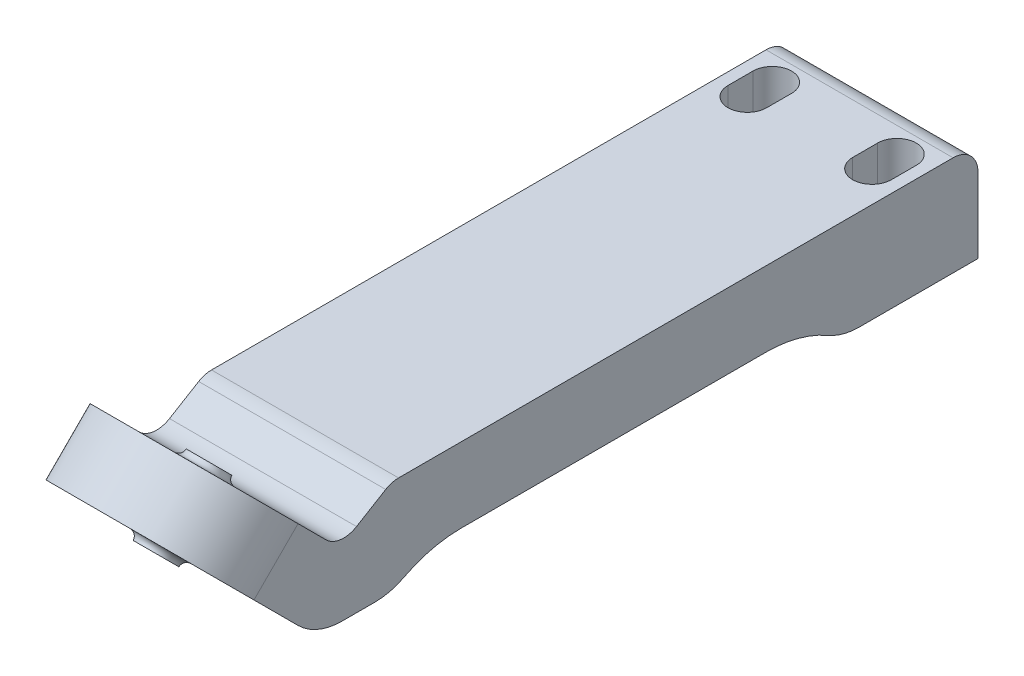
ISO-10303-21;
HEADER;
FILE_DESCRIPTION(('STEP AP214'),'2;1');
FILE_NAME('part.step','',(''),(''),'','','');
FILE_SCHEMA(('AUTOMOTIVE_DESIGN { 1 0 10303 214 1 1 1 1 }'));
ENDSEC;
DATA;
#1=APPLICATION_CONTEXT('core data for automotive mechanical design processes');
#2=APPLICATION_PROTOCOL_DEFINITION('international standard','automotive_design',2000,#1);
#3=PRODUCT_CONTEXT('',#1,'mechanical');
#4=PRODUCT('Part','Part','',(#3));
#5=PRODUCT_RELATED_PRODUCT_CATEGORY('part','',(#4));
#6=PRODUCT_DEFINITION_FORMATION('','',#4);
#7=PRODUCT_DEFINITION_CONTEXT('part definition',#1,'design');
#8=PRODUCT_DEFINITION('design','',#6,#7);
#9=PRODUCT_DEFINITION_SHAPE('','',#8);
#10=(LENGTH_UNIT() NAMED_UNIT(*) SI_UNIT(.MILLI.,.METRE.));
#11=(NAMED_UNIT(*) PLANE_ANGLE_UNIT() SI_UNIT($,.RADIAN.));
#12=(NAMED_UNIT(*) SI_UNIT($,.STERADIAN.) SOLID_ANGLE_UNIT());
#13=UNCERTAINTY_MEASURE_WITH_UNIT(LENGTH_MEASURE(1.E-05),#10,'distance_accuracy_value','');
#14=(GEOMETRIC_REPRESENTATION_CONTEXT(3) GLOBAL_UNCERTAINTY_ASSIGNED_CONTEXT((#13)) GLOBAL_UNIT_ASSIGNED_CONTEXT((#10,
#11,#12)) REPRESENTATION_CONTEXT('',''));
#15=CARTESIAN_POINT('',(0.,0.,0.));
#16=DIRECTION('',(0.,0.,1.));
#17=DIRECTION('',(1.,0.,0.));
#18=AXIS2_PLACEMENT_3D('',#15,#16,#17);
#19=CARTESIAN_POINT('',(-7.5,20.6821178799464,41.));
#20=DIRECTION('',(0.,1.,0.));
#21=DIRECTION('',(0.,0.,1.));
#22=AXIS2_PLACEMENT_3D('',#19,#20,#21);
#23=PLANE('',#22);
#24=DIRECTION('',(0.,0.,-1.));
#25=VECTOR('',#24,1.);
#26=CARTESIAN_POINT('',(6.55000000000001,20.6821178799464,41.));
#27=LINE('',#26,#25);
#28=CARTESIAN_POINT('',(6.55,20.6821178799464,6.00000000000001));
#29=VERTEX_POINT('',#28);
#30=CARTESIAN_POINT('',(6.55000000000001,20.6821178799464,4.));
#31=VERTEX_POINT('',#30);
#32=EDGE_CURVE('E314',#29,#31,#27,.T.);
#33=ORIENTED_EDGE('',*,*,#32,.T.);
#34=CARTESIAN_POINT('',(4.99999999999999,20.6821178799464,4.));
#35=DIRECTION('',(0.,1.,0.));
#36=DIRECTION('',(0.,0.,1.));
#37=AXIS2_PLACEMENT_3D('',#34,#35,#36);
#38=CIRCLE('',#37,1.55);
#39=CARTESIAN_POINT('',(3.45000000000001,20.6821178799464,4.));
#40=VERTEX_POINT('',#39);
#41=EDGE_CURVE('E317',#31,#40,#38,.T.);
#42=ORIENTED_EDGE('',*,*,#41,.T.);
#43=DIRECTION('',(0.,0.,1.));
#44=VECTOR('',#43,1.);
#45=CARTESIAN_POINT('',(3.45,20.6821178799464,41.));
#46=LINE('',#45,#44);
#47=CARTESIAN_POINT('',(3.45000000000001,20.6821178799464,6.00000000000001));
#48=VERTEX_POINT('',#47);
#49=EDGE_CURVE('E308',#40,#48,#46,.T.);
#50=ORIENTED_EDGE('',*,*,#49,.T.);
#51=CARTESIAN_POINT('',(4.99999999999999,20.6821178799464,6.));
#52=DIRECTION('',(0.,1.,0.));
#53=DIRECTION('',(0.,0.,1.));
#54=AXIS2_PLACEMENT_3D('',#51,#52,#53);
#55=CIRCLE('',#54,1.55);
#56=EDGE_CURVE('E311',#48,#29,#55,.T.);
#57=ORIENTED_EDGE('',*,*,#56,.T.);
#58=EDGE_LOOP('',(#33,#42,#50,#57));
#59=FACE_BOUND('',#58,.T.);
#60=DIRECTION('',(0.,0.,-1.));
#61=VECTOR('',#60,1.);
#62=CARTESIAN_POINT('',(-3.45000000000001,20.6821178799464,41.));
#63=LINE('',#62,#61);
#64=CARTESIAN_POINT('',(-3.45000000000001,20.6821178799464,6.));
#65=VERTEX_POINT('',#64);
#66=CARTESIAN_POINT('',(-3.45000000000001,20.6821178799464,4.));
#67=VERTEX_POINT('',#66);
#68=EDGE_CURVE('E326',#65,#67,#63,.T.);
#69=ORIENTED_EDGE('',*,*,#68,.T.);
#70=CARTESIAN_POINT('',(-5.00000000000001,20.6821178799464,4.));
#71=DIRECTION('',(0.,1.,0.));
#72=DIRECTION('',(0.,0.,1.));
#73=AXIS2_PLACEMENT_3D('',#70,#71,#72);
#74=CIRCLE('',#73,1.55);
#75=CARTESIAN_POINT('',(-6.55000000000001,20.6821178799464,3.99999999999999));
#76=VERTEX_POINT('',#75);
#77=EDGE_CURVE('E329',#67,#76,#74,.T.);
#78=ORIENTED_EDGE('',*,*,#77,.T.);
#79=DIRECTION('',(0.,0.,1.));
#80=VECTOR('',#79,1.);
#81=CARTESIAN_POINT('',(-6.55000000000001,20.6821178799464,41.));
#82=LINE('',#81,#80);
#83=CARTESIAN_POINT('',(-6.55000000000001,20.6821178799464,6.00000000000001));
#84=VERTEX_POINT('',#83);
#85=EDGE_CURVE('E320',#76,#84,#82,.T.);
#86=ORIENTED_EDGE('',*,*,#85,.T.);
#87=CARTESIAN_POINT('',(-5.00000000000001,20.6821178799464,6.));
#88=DIRECTION('',(0.,1.,0.));
#89=DIRECTION('',(0.,0.,1.));
#90=AXIS2_PLACEMENT_3D('',#87,#88,#89);
#91=CIRCLE('',#90,1.55);
#92=EDGE_CURVE('E323',#84,#65,#91,.T.);
#93=ORIENTED_EDGE('',*,*,#92,.T.);
#94=EDGE_LOOP('',(#69,#78,#86,#93));
#95=FACE_BOUND('',#94,.T.);
#96=DIRECTION('',(0.,0.,-1.));
#97=VECTOR('',#96,1.);
#98=CARTESIAN_POINT('',(7.5,20.6821178799464,41.));
#99=LINE('',#98,#97);
#100=CARTESIAN_POINT('',(7.5,20.6821178799464,9.51668522645213));
#101=VERTEX_POINT('',#100);
#102=CARTESIAN_POINT('',(7.5,20.6821178799464,0.));
#103=VERTEX_POINT('',#102);
#104=EDGE_CURVE('E301',#101,#103,#99,.T.);
#105=ORIENTED_EDGE('',*,*,#104,.F.);
#106=DIRECTION('',(-1.,0.,0.));
#107=VECTOR('',#106,1.);
#108=CARTESIAN_POINT('',(-7.5,20.6821178799464,9.51668522645213));
#109=LINE('',#108,#107);
#110=CARTESIAN_POINT('',(-7.5,20.6821178799464,9.51668522645213));
#111=VERTEX_POINT('',#110);
#112=EDGE_CURVE('E383',#101,#111,#109,.T.);
#113=ORIENTED_EDGE('',*,*,#112,.T.);
#114=DIRECTION('',(0.,0.,-1.));
#115=VECTOR('',#114,1.);
#116=CARTESIAN_POINT('',(-7.5,20.6821178799464,41.));
#117=LINE('',#116,#115);
#118=CARTESIAN_POINT('',(-7.5,20.6821178799464,0.));
#119=VERTEX_POINT('',#118);
#120=EDGE_CURVE('E303',#111,#119,#117,.T.);
#121=ORIENTED_EDGE('',*,*,#120,.T.);
#122=DIRECTION('',(1.,0.,0.));
#123=VECTOR('',#122,1.);
#124=CARTESIAN_POINT('',(-7.5,20.6821178799464,0.));
#125=LINE('',#124,#123);
#126=EDGE_CURVE('E293',#119,#103,#125,.T.);
#127=ORIENTED_EDGE('',*,*,#126,.T.);
#128=EDGE_LOOP('',(#105,#113,#121,#127));
#129=FACE_BOUND('',#128,.T.);
#130=ADVANCED_FACE('F43',(#59,#95,#129),#23,.F.);
#131=CARTESIAN_POINT('',(7.50000000000001,26.,51.));
#132=DIRECTION('',(0.,0.707106781186551,-0.707106781186544));
#133=DIRECTION('',(0.,0.707106781186544,0.707106781186551));
#134=AXIS2_PLACEMENT_3D('',#131,#132,#133);
#135=PLANE('',#134);
#136=CARTESIAN_POINT('',(0.,29.5355339059327,54.5355339059328));
#137=DIRECTION('',(0.,0.707106781186551,-0.707106781186544));
#138=DIRECTION('',(0.,0.707106781186544,0.707106781186551));
#139=AXIS2_PLACEMENT_3D('',#136,#137,#138);
#140=CIRCLE('',#139,2.);
#141=CARTESIAN_POINT('',(0.,30.9497474683058,55.9497474683059));
#142=VERTEX_POINT('',#141);
#143=EDGE_CURVE('E335',#142,#142,#140,.F.);
#144=ORIENTED_EDGE('',*,*,#143,.T.);
#145=EDGE_LOOP('',(#144));
#146=FACE_BOUND('',#145,.T.);
#147=DIRECTION('',(0.,-0.707106781186544,-0.707106781186551));
#148=VECTOR('',#147,1.);
#149=CARTESIAN_POINT('',(7.50000000000001,26.,51.));
#150=LINE('',#149,#148);
#151=CARTESIAN_POINT('',(7.50000000000001,29.5355339059327,54.5355339059327));
#152=VERTEX_POINT('',#151);
#153=CARTESIAN_POINT('',(7.50000000000001,27.2901535386176,52.2901535386177));
#154=VERTEX_POINT('',#153);
#155=EDGE_CURVE('E242',#152,#154,#150,.T.);
#156=ORIENTED_EDGE('',*,*,#155,.T.);
#157=DIRECTION('',(-1.,0.,0.));
#158=VECTOR('',#157,1.);
#159=CARTESIAN_POINT('',(7.50000000000001,27.2901535386176,52.2901535386177));
#160=LINE('',#159,#158);
#161=CARTESIAN_POINT('',(-7.5,27.2901535386176,52.2901535386177));
#162=VERTEX_POINT('',#161);
#163=EDGE_CURVE('E232',#154,#162,#160,.T.);
#164=ORIENTED_EDGE('',*,*,#163,.T.);
#165=DIRECTION('',(0.,-0.707106781186544,-0.707106781186551));
#166=VECTOR('',#165,1.);
#167=CARTESIAN_POINT('',(-7.5,26.,51.));
#168=LINE('',#167,#166);
#169=CARTESIAN_POINT('',(-7.5,29.5355339059327,54.5355339059327));
#170=VERTEX_POINT('',#169);
#171=EDGE_CURVE('E225',#170,#162,#168,.T.);
#172=ORIENTED_EDGE('',*,*,#171,.F.);
#173=CARTESIAN_POINT('',(0.,29.5355339059327,54.5355339059327));
#174=DIRECTION('',(0.,-0.707106781186551,0.707106781186544));
#175=DIRECTION('',(0.,0.707106781186544,0.707106781186551));
#176=AXIS2_PLACEMENT_3D('',#173,#174,#175);
#177=CIRCLE('',#176,7.5);
#178=EDGE_CURVE('E209',#152,#170,#177,.T.);
#179=ORIENTED_EDGE('',*,*,#178,.F.);
#180=EDGE_LOOP('',(#156,#164,#172,#179));
#181=FACE_BOUND('',#180,.T.);
#182=ADVANCED_FACE('F230',(#146,#181),#135,.T.);
#183=CARTESIAN_POINT('',(7.50000000000001,26.,58.0710678118655));
#184=DIRECTION('',(0.,-0.707106781186551,0.707106781186544));
#185=DIRECTION('',(0.,-0.707106781186544,-0.707106781186551));
#186=AXIS2_PLACEMENT_3D('',#183,#184,#185);
#187=PLANE('',#186);
#188=CARTESIAN_POINT('',(0.,26.,58.0710678118655));
#189=DIRECTION('',(0.,-0.707106781186551,0.707106781186544));
#190=DIRECTION('',(0.,-0.707106781186544,-0.707106781186551));
#191=AXIS2_PLACEMENT_3D('',#188,#189,#190);
#192=CIRCLE('',#191,2.);
#193=CARTESIAN_POINT('',(0.,24.5857864376269,56.6568542494924));
#194=VERTEX_POINT('',#193);
#195=EDGE_CURVE('E332',#194,#194,#192,.F.);
#196=ORIENTED_EDGE('',*,*,#195,.T.);
#197=EDGE_LOOP('',(#196));
#198=FACE_BOUND('',#197,.T.);
#199=DIRECTION('',(0.,0.707106781186544,0.707106781186551));
#200=VECTOR('',#199,1.);
#201=CARTESIAN_POINT('',(-7.5,26.,58.0710678118655));
#202=LINE('',#201,#200);
#203=CARTESIAN_POINT('',(-7.5,22.4644660940672,54.5355339059327));
#204=VERTEX_POINT('',#203);
#205=CARTESIAN_POINT('',(-7.5,26.,58.0710678118655));
#206=VERTEX_POINT('',#205);
#207=EDGE_CURVE('E220',#204,#206,#202,.T.);
#208=ORIENTED_EDGE('',*,*,#207,.F.);
#209=DIRECTION('',(-1.,0.,0.));
#210=VECTOR('',#209,1.);
#211=CARTESIAN_POINT('',(7.50000000000001,22.4644660940672,54.5355339059327));
#212=LINE('',#211,#210);
#213=CARTESIAN_POINT('',(7.50000000000001,22.4644660940672,54.5355339059327));
#214=VERTEX_POINT('',#213);
#215=EDGE_CURVE('E399',#204,#214,#212,.F.);
#216=ORIENTED_EDGE('',*,*,#215,.T.);
#217=DIRECTION('',(0.,0.707106781186544,0.707106781186551));
#218=VECTOR('',#217,1.);
#219=CARTESIAN_POINT('',(7.50000000000001,26.,58.0710678118655));
#220=LINE('',#219,#218);
#221=CARTESIAN_POINT('',(7.50000000000001,26.,58.0710678118655));
#222=VERTEX_POINT('',#221);
#223=EDGE_CURVE('E233',#214,#222,#220,.T.);
#224=ORIENTED_EDGE('',*,*,#223,.T.);
#225=CARTESIAN_POINT('',(0.,26.,58.0710678118655));
#226=DIRECTION('',(0.,-0.707106781186551,0.707106781186544));
#227=DIRECTION('',(0.,0.707106781186544,0.707106781186551));
#228=AXIS2_PLACEMENT_3D('',#225,#226,#227);
#229=CIRCLE('',#228,7.5);
#230=EDGE_CURVE('E221',#222,#206,#229,.T.);
#231=ORIENTED_EDGE('',*,*,#230,.T.);
#232=EDGE_LOOP('',(#208,#216,#224,#231));
#233=FACE_BOUND('',#232,.T.);
#234=ADVANCED_FACE('F436',(#198,#233),#187,.T.);
#235=CARTESIAN_POINT('',(7.5,28.6821178799464,41.));
#236=DIRECTION('',(0.,-1.,0.));
#237=DIRECTION('',(0.,0.,-1.));
#238=AXIS2_PLACEMENT_3D('',#235,#236,#237);
#239=PLANE('',#238);
#240=DIRECTION('',(0.,0.,1.));
#241=VECTOR('',#240,1.);
#242=CARTESIAN_POINT('',(-6.55000000000001,28.6821178799464,3.99999999999999));
#243=LINE('',#242,#241);
#244=CARTESIAN_POINT('',(-6.55000000000001,28.6821178799464,4.));
#245=VERTEX_POINT('',#244);
#246=CARTESIAN_POINT('',(-6.55000000000001,28.6821178799464,6.));
#247=VERTEX_POINT('',#246);
#248=EDGE_CURVE('E254',#245,#247,#243,.T.);
#249=ORIENTED_EDGE('',*,*,#248,.F.);
#250=CARTESIAN_POINT('',(-5.00000000000001,28.6821178799464,4.));
#251=DIRECTION('',(0.,1.,0.));
#252=DIRECTION('',(0.,0.,1.));
#253=AXIS2_PLACEMENT_3D('',#250,#251,#252);
#254=CIRCLE('',#253,1.55);
#255=CARTESIAN_POINT('',(-3.45000000000001,28.6821178799464,4.));
#256=VERTEX_POINT('',#255);
#257=EDGE_CURVE('E252',#256,#245,#254,.T.);
#258=ORIENTED_EDGE('',*,*,#257,.F.);
#259=DIRECTION('',(0.,0.,-1.));
#260=VECTOR('',#259,1.);
#261=CARTESIAN_POINT('',(-3.45000000000001,28.6821178799464,4.));
#262=LINE('',#261,#260);
#263=CARTESIAN_POINT('',(-3.45000000000001,28.6821178799464,6.));
#264=VERTEX_POINT('',#263);
#265=EDGE_CURVE('E261',#264,#256,#262,.T.);
#266=ORIENTED_EDGE('',*,*,#265,.F.);
#267=CARTESIAN_POINT('',(-5.00000000000001,28.6821178799464,6.));
#268=DIRECTION('',(0.,1.,0.));
#269=DIRECTION('',(0.,0.,1.));
#270=AXIS2_PLACEMENT_3D('',#267,#268,#269);
#271=CIRCLE('',#270,1.55);
#272=EDGE_CURVE('E258',#247,#264,#271,.T.);
#273=ORIENTED_EDGE('',*,*,#272,.F.);
#274=EDGE_LOOP('',(#249,#258,#266,#273));
#275=FACE_BOUND('',#274,.T.);
#276=DIRECTION('',(0.,0.,1.));
#277=VECTOR('',#276,1.);
#278=CARTESIAN_POINT('',(3.45000000000001,28.6821178799464,4.));
#279=LINE('',#278,#277);
#280=CARTESIAN_POINT('',(3.45000000000001,28.6821178799464,4.));
#281=VERTEX_POINT('',#280);
#282=CARTESIAN_POINT('',(3.45000000000001,28.6821178799464,6.00000000000001));
#283=VERTEX_POINT('',#282);
#284=EDGE_CURVE('E288',#281,#283,#279,.T.);
#285=ORIENTED_EDGE('',*,*,#284,.F.);
#286=CARTESIAN_POINT('',(4.99999999999999,28.6821178799464,4.));
#287=DIRECTION('',(0.,1.,0.));
#288=DIRECTION('',(0.,0.,-1.));
#289=AXIS2_PLACEMENT_3D('',#286,#287,#288);
#290=CIRCLE('',#289,1.55);
#291=CARTESIAN_POINT('',(6.55000000000001,28.6821178799464,4.));
#292=VERTEX_POINT('',#291);
#293=EDGE_CURVE('E255',#292,#281,#290,.T.);
#294=ORIENTED_EDGE('',*,*,#293,.F.);
#295=DIRECTION('',(0.,0.,-1.));
#296=VECTOR('',#295,1.);
#297=CARTESIAN_POINT('',(6.55000000000001,28.6821178799464,4.));
#298=LINE('',#297,#296);
#299=CARTESIAN_POINT('',(6.55,28.6821178799464,6.00000000000001));
#300=VERTEX_POINT('',#299);
#301=EDGE_CURVE('E277',#300,#292,#298,.T.);
#302=ORIENTED_EDGE('',*,*,#301,.F.);
#303=CARTESIAN_POINT('',(4.99999999999999,28.6821178799464,6.));
#304=DIRECTION('',(0.,1.,0.));
#305=DIRECTION('',(0.,0.,-1.));
#306=AXIS2_PLACEMENT_3D('',#303,#304,#305);
#307=CIRCLE('',#306,1.55);
#308=EDGE_CURVE('E285',#283,#300,#307,.T.);
#309=ORIENTED_EDGE('',*,*,#308,.F.);
#310=EDGE_LOOP('',(#285,#294,#302,#309));
#311=FACE_BOUND('',#310,.T.);
#312=DIRECTION('',(0.,0.,-1.));
#313=VECTOR('',#312,1.);
#314=CARTESIAN_POINT('',(7.5,28.6821178799464,41.));
#315=LINE('',#314,#313);
#316=CARTESIAN_POINT('',(7.5,28.6821178799464,46.4751117573865));
#317=VERTEX_POINT('',#316);
#318=CARTESIAN_POINT('',(7.5,28.6821178799464,2.));
#319=VERTEX_POINT('',#318);
#320=EDGE_CURVE('E298',#317,#319,#315,.T.);
#321=ORIENTED_EDGE('',*,*,#320,.T.);
#322=DIRECTION('',(-1.,0.,0.));
#323=VECTOR('',#322,1.);
#324=CARTESIAN_POINT('',(7.5,28.6821178799464,2.));
#325=LINE('',#324,#323);
#326=CARTESIAN_POINT('',(-7.5,28.6821178799464,2.));
#327=VERTEX_POINT('',#326);
#328=EDGE_CURVE('E401',#319,#327,#325,.T.);
#329=ORIENTED_EDGE('',*,*,#328,.T.);
#330=DIRECTION('',(0.,0.,-1.));
#331=VECTOR('',#330,1.);
#332=CARTESIAN_POINT('',(-7.5,28.6821178799464,41.));
#333=LINE('',#332,#331);
#334=CARTESIAN_POINT('',(-7.5,28.6821178799464,46.4751117573865));
#335=VERTEX_POINT('',#334);
#336=EDGE_CURVE('E306',#335,#327,#333,.T.);
#337=ORIENTED_EDGE('',*,*,#336,.F.);
#338=DIRECTION('',(1.,0.,0.));
#339=VECTOR('',#338,1.);
#340=CARTESIAN_POINT('',(7.5,28.6821178799464,46.4751117573865));
#341=LINE('',#340,#339);
#342=EDGE_CURVE('E344',#335,#317,#341,.T.);
#343=ORIENTED_EDGE('',*,*,#342,.T.);
#344=EDGE_LOOP('',(#321,#329,#337,#343));
#345=FACE_BOUND('',#344,.T.);
#346=ADVANCED_FACE('F407',(#275,#311,#345),#239,.F.);
#347=CARTESIAN_POINT('',(-7.5,28.6821178799464,41.));
#348=DIRECTION('',(1.,0.,0.));
#349=DIRECTION('',(0.,0.,-1.));
#350=AXIS2_PLACEMENT_3D('',#347,#348,#349);
#351=PLANE('',#350);
#352=ORIENTED_EDGE('',*,*,#336,.T.);
#353=CARTESIAN_POINT('',(-7.5,26.6821178799464,2.));
#354=DIRECTION('',(1.,0.,0.));
#355=DIRECTION('',(0.,0.,-1.));
#356=AXIS2_PLACEMENT_3D('',#353,#354,#355);
#357=CIRCLE('',#356,2.);
#358=CARTESIAN_POINT('',(-7.5,26.6821178799464,0.));
#359=VERTEX_POINT('',#358);
#360=EDGE_CURVE('E65',#327,#359,#357,.F.);
#361=ORIENTED_EDGE('',*,*,#360,.T.);
#362=DIRECTION('',(0.,-1.,0.));
#363=VECTOR('',#362,1.);
#364=CARTESIAN_POINT('',(-7.5,28.6821178799464,0.));
#365=LINE('',#364,#363);
#366=EDGE_CURVE('E267',#359,#119,#365,.T.);
#367=ORIENTED_EDGE('',*,*,#366,.T.);
#368=ORIENTED_EDGE('',*,*,#120,.F.);
#369=CARTESIAN_POINT('',(-7.5,25.6821178799464,9.51668522645213));
#370=DIRECTION('',(1.,0.,0.));
#371=DIRECTION('',(0.,0.,-1.));
#372=AXIS2_PLACEMENT_3D('',#369,#370,#371);
#373=CIRCLE('',#372,5.);
#374=CARTESIAN_POINT('',(-7.5,21.3487845466131,12.0111234843014));
#375=VERTEX_POINT('',#374);
#376=EDGE_CURVE('E389',#111,#375,#373,.F.);
#377=ORIENTED_EDGE('',*,*,#376,.T.);
#378=CARTESIAN_POINT('',(-7.5,12.6821178799464,17.));
#379=DIRECTION('',(1.,0.,0.));
#380=DIRECTION('',(0.,0.,-1.));
#381=AXIS2_PLACEMENT_3D('',#378,#379,#380);
#382=CIRCLE('',#381,10.);
#383=CARTESIAN_POINT('',(-7.5,22.6821178799464,17.));
#384=VERTEX_POINT('',#383);
#385=EDGE_CURVE('E364',#375,#384,#382,.T.);
#386=ORIENTED_EDGE('',*,*,#385,.T.);
#387=DIRECTION('',(0.,0.,-1.));
#388=VECTOR('',#387,1.);
#389=CARTESIAN_POINT('',(-7.5,22.6821178799464,47.));
#390=LINE('',#389,#388);
#391=CARTESIAN_POINT('',(-7.5,22.6821178799464,41.4490688135329));
#392=VERTEX_POINT('',#391);
#393=EDGE_CURVE('E248',#392,#384,#390,.T.);
#394=ORIENTED_EDGE('',*,*,#393,.F.);
#395=CARTESIAN_POINT('',(-7.5,12.6821178799464,41.4490688135329));
#396=DIRECTION('',(1.,0.,0.));
#397=DIRECTION('',(0.,0.,-1.));
#398=AXIS2_PLACEMENT_3D('',#395,#396,#397);
#399=CIRCLE('',#398,10.);
#400=CARTESIAN_POINT('',(-7.5,21.5607059599821,46.0502288525934));
#401=VERTEX_POINT('',#400);
#402=EDGE_CURVE('E371',#392,#401,#399,.T.);
#403=ORIENTED_EDGE('',*,*,#402,.T.);
#404=CARTESIAN_POINT('',(-7.5,26.,48.3508088721237));
#405=DIRECTION('',(1.,0.,0.));
#406=DIRECTION('',(0.,0.,-1.));
#407=AXIS2_PLACEMENT_3D('',#404,#405,#406);
#408=CIRCLE('',#407,5.);
#409=CARTESIAN_POINT('',(-7.5,21.,48.3508088721237));
#410=VERTEX_POINT('',#409);
#411=EDGE_CURVE('E387',#401,#410,#408,.F.);
#412=ORIENTED_EDGE('',*,*,#411,.T.);
#413=DIRECTION('',(0.,0.,-1.));
#414=VECTOR('',#413,1.);
#415=CARTESIAN_POINT('',(-7.5,21.,51.));
#416=LINE('',#415,#414);
#417=CARTESIAN_POINT('',(-7.5,21.,51.));
#418=VERTEX_POINT('',#417);
#419=EDGE_CURVE('E241',#418,#410,#416,.T.);
#420=ORIENTED_EDGE('',*,*,#419,.F.);
#421=CARTESIAN_POINT('',(-7.5,26.,51.));
#422=DIRECTION('',(1.,0.,0.));
#423=DIRECTION('',(0.,0.,-1.));
#424=AXIS2_PLACEMENT_3D('',#421,#422,#423);
#425=CIRCLE('',#424,5.);
#426=EDGE_CURVE('E385',#418,#204,#425,.F.);
#427=ORIENTED_EDGE('',*,*,#426,.T.);
#428=ORIENTED_EDGE('',*,*,#207,.T.);
#429=DIRECTION('',(0.,0.707106781186551,-0.707106781186544));
#430=VECTOR('',#429,1.);
#431=CARTESIAN_POINT('',(-7.5,29.5355339059327,54.5355339059328));
#432=LINE('',#431,#430);
#433=EDGE_CURVE('E213',#206,#170,#432,.T.);
#434=ORIENTED_EDGE('',*,*,#433,.T.);
#435=ORIENTED_EDGE('',*,*,#171,.T.);
#436=CARTESIAN_POINT('',(-7.5,28.7043671009907,50.8759399762446));
#437=DIRECTION('',(1.,0.,0.));
#438=DIRECTION('',(0.,0.,-1.));
#439=AXIS2_PLACEMENT_3D('',#436,#437,#438);
#440=CIRCLE('',#439,2.);
#441=CARTESIAN_POINT('',(-7.5,26.9900324995865,49.8458638264245));
#442=VERTEX_POINT('',#441);
#443=EDGE_CURVE('E356',#162,#442,#440,.T.);
#444=ORIENTED_EDGE('',*,*,#443,.T.);
#445=DIRECTION('',(0.,0.515038074910051,-0.857167300702114));
#446=VECTOR('',#445,1.);
#447=CARTESIAN_POINT('',(-7.5,31.3440992919737,42.5994797990706));
#448=LINE('',#447,#446);
#449=CARTESIAN_POINT('',(-7.5,28.3964524813507,47.5051879072066));
#450=VERTEX_POINT('',#449);
#451=EDGE_CURVE('E338',#442,#450,#448,.T.);
#452=ORIENTED_EDGE('',*,*,#451,.T.);
#453=CARTESIAN_POINT('',(-7.5,26.6821178799464,46.4751117573865));
#454=DIRECTION('',(1.,0.,0.));
#455=DIRECTION('',(0.,0.,-1.));
#456=AXIS2_PLACEMENT_3D('',#453,#454,#455);
#457=CIRCLE('',#456,2.);
#458=EDGE_CURVE('E353',#450,#335,#457,.F.);
#459=ORIENTED_EDGE('',*,*,#458,.T.);
#460=EDGE_LOOP('',(#352,#361,#367,#368,#377,#386,#394,#403,#412,#420,#427,#428,#434,#435,#444,
#452,#459));
#461=FACE_BOUND('',#460,.T.);
#462=ADVANCED_FACE('F224',(#461),#351,.F.);
#463=CARTESIAN_POINT('',(7.5,20.6821178799464,41.));
#464=DIRECTION('',(-1.,0.,0.));
#465=DIRECTION('',(0.,0.,1.));
#466=AXIS2_PLACEMENT_3D('',#463,#464,#465);
#467=PLANE('',#466);
#468=DIRECTION('',(0.,1.,0.));
#469=VECTOR('',#468,1.);
#470=CARTESIAN_POINT('',(7.5,20.6821178799464,0.));
#471=LINE('',#470,#469);
#472=CARTESIAN_POINT('',(7.5,26.6821178799464,0.));
#473=VERTEX_POINT('',#472);
#474=EDGE_CURVE('E296',#103,#473,#471,.T.);
#475=ORIENTED_EDGE('',*,*,#474,.T.);
#476=CARTESIAN_POINT('',(7.5,26.6821178799464,2.));
#477=DIRECTION('',(-1.,0.,0.));
#478=DIRECTION('',(0.,0.,1.));
#479=AXIS2_PLACEMENT_3D('',#476,#477,#478);
#480=CIRCLE('',#479,2.);
#481=EDGE_CURVE('E11',#473,#319,#480,.F.);
#482=ORIENTED_EDGE('',*,*,#481,.T.);
#483=ORIENTED_EDGE('',*,*,#320,.F.);
#484=CARTESIAN_POINT('',(7.5,26.6821178799464,46.4751117573865));
#485=DIRECTION('',(-1.,0.,0.));
#486=DIRECTION('',(0.,0.,1.));
#487=AXIS2_PLACEMENT_3D('',#484,#485,#486);
#488=CIRCLE('',#487,2.);
#489=CARTESIAN_POINT('',(7.5,28.3964524813507,47.5051879072066));
#490=VERTEX_POINT('',#489);
#491=EDGE_CURVE('E347',#317,#490,#488,.F.);
#492=ORIENTED_EDGE('',*,*,#491,.T.);
#493=DIRECTION('',(0.,-0.515038074910051,0.857167300702114));
#494=VECTOR('',#493,1.);
#495=CARTESIAN_POINT('',(7.5,29.2219855431173,46.1312701705063));
#496=LINE('',#495,#494);
#497=CARTESIAN_POINT('',(7.5,26.9900324995865,49.8458638264245));
#498=VERTEX_POINT('',#497);
#499=EDGE_CURVE('E341',#490,#498,#496,.T.);
#500=ORIENTED_EDGE('',*,*,#499,.T.);
#501=CARTESIAN_POINT('',(7.5,28.7043671009907,50.8759399762446));
#502=DIRECTION('',(-1.,0.,0.));
#503=DIRECTION('',(0.,0.,1.));
#504=AXIS2_PLACEMENT_3D('',#501,#502,#503);
#505=CIRCLE('',#504,2.);
#506=EDGE_CURVE('E358',#498,#154,#505,.T.);
#507=ORIENTED_EDGE('',*,*,#506,.T.);
#508=ORIENTED_EDGE('',*,*,#155,.F.);
#509=DIRECTION('',(0.,0.707106781186551,-0.707106781186544));
#510=VECTOR('',#509,1.);
#511=CARTESIAN_POINT('',(7.50000000000001,29.5355339059327,54.5355339059328));
#512=LINE('',#511,#510);
#513=EDGE_CURVE('E215',#222,#152,#512,.T.);
#514=ORIENTED_EDGE('',*,*,#513,.F.);
#515=ORIENTED_EDGE('',*,*,#223,.F.);
#516=CARTESIAN_POINT('',(7.5,26.,51.));
#517=DIRECTION('',(-1.,0.,0.));
#518=DIRECTION('',(0.,0.,1.));
#519=AXIS2_PLACEMENT_3D('',#516,#517,#518);
#520=CIRCLE('',#519,5.);
#521=CARTESIAN_POINT('',(7.5,21.,51.));
#522=VERTEX_POINT('',#521);
#523=EDGE_CURVE('E377',#214,#522,#520,.F.);
#524=ORIENTED_EDGE('',*,*,#523,.T.);
#525=DIRECTION('',(0.,0.,-1.));
#526=VECTOR('',#525,1.);
#527=CARTESIAN_POINT('',(7.5,21.,51.));
#528=LINE('',#527,#526);
#529=CARTESIAN_POINT('',(7.5,21.,48.3508088721237));
#530=VERTEX_POINT('',#529);
#531=EDGE_CURVE('E238',#522,#530,#528,.T.);
#532=ORIENTED_EDGE('',*,*,#531,.T.);
#533=CARTESIAN_POINT('',(7.5,26.,48.3508088721237));
#534=DIRECTION('',(-1.,0.,0.));
#535=DIRECTION('',(0.,0.,1.));
#536=AXIS2_PLACEMENT_3D('',#533,#534,#535);
#537=CIRCLE('',#536,5.);
#538=CARTESIAN_POINT('',(7.5,21.5607059599821,46.0502288525934));
#539=VERTEX_POINT('',#538);
#540=EDGE_CURVE('E379',#530,#539,#537,.F.);
#541=ORIENTED_EDGE('',*,*,#540,.T.);
#542=CARTESIAN_POINT('',(7.5,12.6821178799464,41.4490688135329));
#543=DIRECTION('',(-1.,0.,0.));
#544=DIRECTION('',(0.,0.,1.));
#545=AXIS2_PLACEMENT_3D('',#542,#543,#544);
#546=CIRCLE('',#545,10.);
#547=CARTESIAN_POINT('',(7.5,22.6821178799464,41.4490688135329));
#548=VERTEX_POINT('',#547);
#549=EDGE_CURVE('E369',#539,#548,#546,.T.);
#550=ORIENTED_EDGE('',*,*,#549,.T.);
#551=DIRECTION('',(0.,0.,-1.));
#552=VECTOR('',#551,1.);
#553=CARTESIAN_POINT('',(7.5,22.6821178799464,47.));
#554=LINE('',#553,#552);
#555=CARTESIAN_POINT('',(7.5,22.6821178799464,17.));
#556=VERTEX_POINT('',#555);
#557=EDGE_CURVE('E245',#548,#556,#554,.T.);
#558=ORIENTED_EDGE('',*,*,#557,.T.);
#559=CARTESIAN_POINT('',(7.5,12.6821178799464,17.));
#560=DIRECTION('',(-1.,0.,0.));
#561=DIRECTION('',(0.,0.,1.));
#562=AXIS2_PLACEMENT_3D('',#559,#560,#561);
#563=CIRCLE('',#562,10.);
#564=CARTESIAN_POINT('',(7.5,21.3487845466131,12.0111234843014));
#565=VERTEX_POINT('',#564);
#566=EDGE_CURVE('E366',#556,#565,#563,.T.);
#567=ORIENTED_EDGE('',*,*,#566,.T.);
#568=CARTESIAN_POINT('',(7.5,25.6821178799464,9.51668522645213));
#569=DIRECTION('',(-1.,0.,0.));
#570=DIRECTION('',(0.,0.,1.));
#571=AXIS2_PLACEMENT_3D('',#568,#569,#570);
#572=CIRCLE('',#571,5.);
#573=EDGE_CURVE('E381',#565,#101,#572,.F.);
#574=ORIENTED_EDGE('',*,*,#573,.T.);
#575=ORIENTED_EDGE('',*,*,#104,.T.);
#576=EDGE_LOOP('',(#475,#482,#483,#492,#500,#507,#508,#514,#515,#524,#532,#541,#550,#558,#567,
#574,#575));
#577=FACE_BOUND('',#576,.T.);
#578=ADVANCED_FACE('F418',(#577),#467,.F.);
#579=CARTESIAN_POINT('',(0.,0.,0.));
#580=DIRECTION('',(0.,0.,1.));
#581=DIRECTION('',(1.,0.,0.));
#582=AXIS2_PLACEMENT_3D('',#579,#580,#581);
#583=PLANE('',#582);
#584=ORIENTED_EDGE('',*,*,#366,.F.);
#585=DIRECTION('',(-1.,0.,0.));
#586=VECTOR('',#585,1.);
#587=CARTESIAN_POINT('',(0.,26.6821178799464,0.));
#588=LINE('',#587,#586);
#589=EDGE_CURVE('E51',#359,#473,#588,.F.);
#590=ORIENTED_EDGE('',*,*,#589,.T.);
#591=ORIENTED_EDGE('',*,*,#474,.F.);
#592=ORIENTED_EDGE('',*,*,#126,.F.);
#593=EDGE_LOOP('',(#584,#590,#591,#592));
#594=FACE_BOUND('',#593,.T.);
#595=ADVANCED_FACE('F562',(#594),#583,.F.);
#596=CARTESIAN_POINT('',(4.99999999999999,17.6821178799464,4.));
#597=DIRECTION('',(0.,1.,0.));
#598=DIRECTION('',(0.,0.,1.));
#599=AXIS2_PLACEMENT_3D('',#596,#597,#598);
#600=CYLINDRICAL_SURFACE('',#599,1.55);
#601=DIRECTION('',(0.,1.,0.));
#602=VECTOR('',#601,1.);
#603=CARTESIAN_POINT('',(6.55000000000001,17.6821178799464,4.));
#604=LINE('',#603,#602);
#605=EDGE_CURVE('E251',#31,#292,#604,.T.);
#606=ORIENTED_EDGE('',*,*,#605,.T.);
#607=ORIENTED_EDGE('',*,*,#293,.T.);
#608=DIRECTION('',(0.,1.,0.));
#609=VECTOR('',#608,1.);
#610=CARTESIAN_POINT('',(3.45000000000001,17.6821178799464,4.));
#611=LINE('',#610,#609);
#612=EDGE_CURVE('E274',#40,#281,#611,.T.);
#613=ORIENTED_EDGE('',*,*,#612,.F.);
#614=ORIENTED_EDGE('',*,*,#41,.F.);
#615=EDGE_LOOP('',(#606,#607,#613,#614));
#616=FACE_BOUND('',#615,.T.);
#617=ADVANCED_FACE('F558',(#616),#600,.F.);
#618=CARTESIAN_POINT('',(6.55000000000001,17.6821178799464,4.));
#619=DIRECTION('',(1.,0.,0.));
#620=DIRECTION('',(0.,0.,-1.));
#621=AXIS2_PLACEMENT_3D('',#618,#619,#620);
#622=PLANE('',#621);
#623=DIRECTION('',(0.,1.,0.));
#624=VECTOR('',#623,1.);
#625=CARTESIAN_POINT('',(6.55,17.6821178799464,6.00000000000001));
#626=LINE('',#625,#624);
#627=EDGE_CURVE('E280',#29,#300,#626,.T.);
#628=ORIENTED_EDGE('',*,*,#627,.T.);
#629=ORIENTED_EDGE('',*,*,#301,.T.);
#630=ORIENTED_EDGE('',*,*,#605,.F.);
#631=ORIENTED_EDGE('',*,*,#32,.F.);
#632=EDGE_LOOP('',(#628,#629,#630,#631));
#633=FACE_BOUND('',#632,.T.);
#634=ADVANCED_FACE('F561',(#633),#622,.F.);
#635=CARTESIAN_POINT('',(4.99999999999999,17.6821178799464,6.));
#636=DIRECTION('',(0.,1.,0.));
#637=DIRECTION('',(0.,0.,1.));
#638=AXIS2_PLACEMENT_3D('',#635,#636,#637);
#639=CYLINDRICAL_SURFACE('',#638,1.55);
#640=DIRECTION('',(0.,1.,0.));
#641=VECTOR('',#640,1.);
#642=CARTESIAN_POINT('',(3.45000000000001,17.6821178799464,6.00000000000001));
#643=LINE('',#642,#641);
#644=EDGE_CURVE('E278',#48,#283,#643,.T.);
#645=ORIENTED_EDGE('',*,*,#644,.T.);
#646=ORIENTED_EDGE('',*,*,#308,.T.);
#647=ORIENTED_EDGE('',*,*,#627,.F.);
#648=ORIENTED_EDGE('',*,*,#56,.F.);
#649=EDGE_LOOP('',(#645,#646,#647,#648));
#650=FACE_BOUND('',#649,.T.);
#651=ADVANCED_FACE('F566',(#650),#639,.F.);
#652=CARTESIAN_POINT('',(3.45000000000001,17.6821178799464,4.));
#653=DIRECTION('',(-1.,0.,0.));
#654=DIRECTION('',(0.,0.,1.));
#655=AXIS2_PLACEMENT_3D('',#652,#653,#654);
#656=PLANE('',#655);
#657=ORIENTED_EDGE('',*,*,#612,.T.);
#658=ORIENTED_EDGE('',*,*,#284,.T.);
#659=ORIENTED_EDGE('',*,*,#644,.F.);
#660=ORIENTED_EDGE('',*,*,#49,.F.);
#661=EDGE_LOOP('',(#657,#658,#659,#660));
#662=FACE_BOUND('',#661,.T.);
#663=ADVANCED_FACE('F556',(#662),#656,.F.);
#664=CARTESIAN_POINT('',(-5.00000000000001,17.6821178799464,4.));
#665=DIRECTION('',(0.,1.,0.));
#666=DIRECTION('',(0.,0.,1.));
#667=AXIS2_PLACEMENT_3D('',#664,#665,#666);
#668=CYLINDRICAL_SURFACE('',#667,1.55);
#669=DIRECTION('',(0.,1.,0.));
#670=VECTOR('',#669,1.);
#671=CARTESIAN_POINT('',(-3.45000000000001,17.6821178799464,4.));
#672=LINE('',#671,#670);
#673=EDGE_CURVE('E265',#67,#256,#672,.T.);
#674=ORIENTED_EDGE('',*,*,#673,.T.);
#675=ORIENTED_EDGE('',*,*,#257,.T.);
#676=DIRECTION('',(0.,1.,0.));
#677=VECTOR('',#676,1.);
#678=CARTESIAN_POINT('',(-6.55000000000001,17.6821178799464,3.99999999999999));
#679=LINE('',#678,#677);
#680=EDGE_CURVE('E264',#76,#245,#679,.T.);
#681=ORIENTED_EDGE('',*,*,#680,.F.);
#682=ORIENTED_EDGE('',*,*,#77,.F.);
#683=EDGE_LOOP('',(#674,#675,#681,#682));
#684=FACE_BOUND('',#683,.T.);
#685=ADVANCED_FACE('F546',(#684),#668,.F.);
#686=CARTESIAN_POINT('',(-3.45000000000001,17.6821178799464,4.));
#687=DIRECTION('',(1.,0.,0.));
#688=DIRECTION('',(0.,0.,-1.));
#689=AXIS2_PLACEMENT_3D('',#686,#687,#688);
#690=PLANE('',#689);
#691=DIRECTION('',(0.,1.,0.));
#692=VECTOR('',#691,1.);
#693=CARTESIAN_POINT('',(-3.45000000000001,17.6821178799464,6.));
#694=LINE('',#693,#692);
#695=EDGE_CURVE('E268',#65,#264,#694,.T.);
#696=ORIENTED_EDGE('',*,*,#695,.T.);
#697=ORIENTED_EDGE('',*,*,#265,.T.);
#698=ORIENTED_EDGE('',*,*,#673,.F.);
#699=ORIENTED_EDGE('',*,*,#68,.F.);
#700=EDGE_LOOP('',(#696,#697,#698,#699));
#701=FACE_BOUND('',#700,.T.);
#702=ADVANCED_FACE('F542',(#701),#690,.F.);
#703=CARTESIAN_POINT('',(-5.00000000000001,17.6821178799464,6.));
#704=DIRECTION('',(0.,1.,0.));
#705=DIRECTION('',(0.,0.,1.));
#706=AXIS2_PLACEMENT_3D('',#703,#704,#705);
#707=CYLINDRICAL_SURFACE('',#706,1.55);
#708=DIRECTION('',(0.,1.,0.));
#709=VECTOR('',#708,1.);
#710=CARTESIAN_POINT('',(-6.55000000000001,17.6821178799464,6.));
#711=LINE('',#710,#709);
#712=EDGE_CURVE('E270',#84,#247,#711,.T.);
#713=ORIENTED_EDGE('',*,*,#712,.T.);
#714=ORIENTED_EDGE('',*,*,#272,.T.);
#715=ORIENTED_EDGE('',*,*,#695,.F.);
#716=ORIENTED_EDGE('',*,*,#92,.F.);
#717=EDGE_LOOP('',(#713,#714,#715,#716));
#718=FACE_BOUND('',#717,.T.);
#719=ADVANCED_FACE('F545',(#718),#707,.F.);
#720=CARTESIAN_POINT('',(-6.55000000000001,17.6821178799464,3.99999999999999));
#721=DIRECTION('',(-1.,0.,0.));
#722=DIRECTION('',(0.,0.,1.));
#723=AXIS2_PLACEMENT_3D('',#720,#721,#722);
#724=PLANE('',#723);
#725=ORIENTED_EDGE('',*,*,#680,.T.);
#726=ORIENTED_EDGE('',*,*,#248,.T.);
#727=ORIENTED_EDGE('',*,*,#712,.F.);
#728=ORIENTED_EDGE('',*,*,#85,.F.);
#729=EDGE_LOOP('',(#725,#726,#727,#728));
#730=FACE_BOUND('',#729,.T.);
#731=ADVANCED_FACE('F540',(#730),#724,.F.);
#732=CARTESIAN_POINT('',(-7.5,22.6821178799464,47.));
#733=DIRECTION('',(0.,1.,0.));
#734=DIRECTION('',(0.,0.,1.));
#735=AXIS2_PLACEMENT_3D('',#732,#733,#734);
#736=PLANE('',#735);
#737=ORIENTED_EDGE('',*,*,#393,.T.);
#738=DIRECTION('',(-1.,0.,0.));
#739=VECTOR('',#738,1.);
#740=CARTESIAN_POINT('',(-7.5,22.6821178799464,17.));
#741=LINE('',#740,#739);
#742=EDGE_CURVE('E362',#384,#556,#741,.F.);
#743=ORIENTED_EDGE('',*,*,#742,.T.);
#744=ORIENTED_EDGE('',*,*,#557,.F.);
#745=DIRECTION('',(1.,0.,0.));
#746=VECTOR('',#745,1.);
#747=CARTESIAN_POINT('',(-7.5,22.6821178799464,41.4490688135329));
#748=LINE('',#747,#746);
#749=EDGE_CURVE('E360',#548,#392,#748,.F.);
#750=ORIENTED_EDGE('',*,*,#749,.T.);
#751=EDGE_LOOP('',(#737,#743,#744,#750));
#752=FACE_BOUND('',#751,.T.);
#753=ADVANCED_FACE('F538',(#752),#736,.F.);
#754=CARTESIAN_POINT('',(7.5,21.,51.));
#755=DIRECTION('',(0.,1.,0.));
#756=DIRECTION('',(0.,0.,1.));
#757=AXIS2_PLACEMENT_3D('',#754,#755,#756);
#758=PLANE('',#757);
#759=ORIENTED_EDGE('',*,*,#419,.T.);
#760=DIRECTION('',(1.,0.,0.));
#761=VECTOR('',#760,1.);
#762=CARTESIAN_POINT('',(7.5,21.,48.3508088721237));
#763=LINE('',#762,#761);
#764=EDGE_CURVE('E394',#410,#530,#763,.T.);
#765=ORIENTED_EDGE('',*,*,#764,.T.);
#766=ORIENTED_EDGE('',*,*,#531,.F.);
#767=DIRECTION('',(-1.,0.,0.));
#768=VECTOR('',#767,1.);
#769=CARTESIAN_POINT('',(-7.5,21.,51.));
#770=LINE('',#769,#768);
#771=EDGE_CURVE('E391',#522,#418,#770,.T.);
#772=ORIENTED_EDGE('',*,*,#771,.T.);
#773=EDGE_LOOP('',(#759,#765,#766,#772));
#774=FACE_BOUND('',#773,.T.);
#775=ADVANCED_FACE('F493',(#774),#758,.F.);
#776=CARTESIAN_POINT('',(0.,29.5355339059327,54.5355339059327));
#777=DIRECTION('',(0.,-0.707106781186551,0.707106781186544));
#778=DIRECTION('',(0.,-0.707106781186544,-0.707106781186551));
#779=AXIS2_PLACEMENT_3D('',#776,#777,#778);
#780=CYLINDRICAL_SURFACE('',#779,7.5);
#781=ORIENTED_EDGE('',*,*,#230,.F.);
#782=ORIENTED_EDGE('',*,*,#513,.T.);
#783=ORIENTED_EDGE('',*,*,#178,.T.);
#784=ORIENTED_EDGE('',*,*,#433,.F.);
#785=EDGE_LOOP('',(#781,#782,#783,#784));
#786=FACE_BOUND('',#785,.T.);
#787=ADVANCED_FACE('F212',(#786),#780,.T.);
#788=CARTESIAN_POINT('',(0.,29.5355339059327,54.5355339059327));
#789=DIRECTION('',(0.,-0.707106781186551,0.707106781186544));
#790=DIRECTION('',(0.,-0.707106781186544,-0.707106781186551));
#791=AXIS2_PLACEMENT_3D('',#788,#789,#790);
#792=CYLINDRICAL_SURFACE('',#791,1.1);
#793=CARTESIAN_POINT('',(0.,25.6464466094067,58.4246212024587));
#794=DIRECTION('',(0.,-0.707106781186551,0.707106781186544));
#795=DIRECTION('',(0.,-0.707106781186544,-0.707106781186551));
#796=AXIS2_PLACEMENT_3D('',#793,#794,#795);
#797=CIRCLE('',#796,1.10000000000001);
#798=CARTESIAN_POINT('',(0.,24.8686291501015,57.6468037431535));
#799=VERTEX_POINT('',#798);
#800=EDGE_CURVE('E507',#799,#799,#797,.T.);
#801=ORIENTED_EDGE('',*,*,#800,.T.);
#802=EDGE_LOOP('',(#801));
#803=FACE_BOUND('',#802,.T.);
#804=CARTESIAN_POINT('',(0.,29.889087296526,54.1819805153395));
#805=DIRECTION('',(0.,0.707106781186551,-0.707106781186544));
#806=DIRECTION('',(0.,0.707106781186544,0.707106781186551));
#807=AXIS2_PLACEMENT_3D('',#804,#805,#806);
#808=CIRCLE('',#807,1.1);
#809=CARTESIAN_POINT('',(0.,30.6669047558312,54.9597979746447));
#810=VERTEX_POINT('',#809);
#811=EDGE_CURVE('E513',#810,#810,#808,.T.);
#812=ORIENTED_EDGE('',*,*,#811,.T.);
#813=EDGE_LOOP('',(#812));
#814=FACE_BOUND('',#813,.T.);
#815=ADVANCED_FACE('F517',(#803,#814),#792,.F.);
#816=CARTESIAN_POINT('',(0.,25.6464466094067,58.4246212024587));
#817=DIRECTION('',(0.,-0.707106781186551,0.707106781186544));
#818=DIRECTION('',(0.,-0.707106781186544,-0.707106781186551));
#819=AXIS2_PLACEMENT_3D('',#816,#817,#818);
#820=PLANE('',#819);
#821=CARTESIAN_POINT('',(0.,25.6464466094067,58.4246212024587));
#822=DIRECTION('',(0.,-0.707106781186551,0.707106781186544));
#823=DIRECTION('',(0.,-0.707106781186544,-0.707106781186551));
#824=AXIS2_PLACEMENT_3D('',#821,#822,#823);
#825=CIRCLE('',#824,1.5);
#826=CARTESIAN_POINT('',(0.,24.5857864376269,57.3639610306789));
#827=VERTEX_POINT('',#826);
#828=EDGE_CURVE('E503',#827,#827,#825,.T.);
#829=ORIENTED_EDGE('',*,*,#828,.T.);
#830=EDGE_LOOP('',(#829));
#831=FACE_BOUND('',#830,.T.);
#832=ORIENTED_EDGE('',*,*,#800,.F.);
#833=EDGE_LOOP('',(#832));
#834=FACE_BOUND('',#833,.T.);
#835=ADVANCED_FACE('F520',(#831,#834),#820,.T.);
#836=CARTESIAN_POINT('',(0.,29.889087296526,54.1819805153395));
#837=DIRECTION('',(0.,0.707106781186551,-0.707106781186544));
#838=DIRECTION('',(0.,0.707106781186544,0.707106781186551));
#839=AXIS2_PLACEMENT_3D('',#836,#837,#838);
#840=PLANE('',#839);
#841=CARTESIAN_POINT('',(0.,29.889087296526,54.1819805153395));
#842=DIRECTION('',(0.,0.707106781186551,-0.707106781186544));
#843=DIRECTION('',(0.,0.707106781186544,0.707106781186551));
#844=AXIS2_PLACEMENT_3D('',#841,#842,#843);
#845=CIRCLE('',#844,1.5);
#846=CARTESIAN_POINT('',(0.,30.9497474683058,55.2426406871193));
#847=VERTEX_POINT('',#846);
#848=EDGE_CURVE('E510',#847,#847,#845,.T.);
#849=ORIENTED_EDGE('',*,*,#848,.T.);
#850=EDGE_LOOP('',(#849));
#851=FACE_BOUND('',#850,.T.);
#852=ORIENTED_EDGE('',*,*,#811,.F.);
#853=EDGE_LOOP('',(#852));
#854=FACE_BOUND('',#853,.T.);
#855=ADVANCED_FACE('F452',(#851,#854),#840,.T.);
#856=CARTESIAN_POINT('',(0.,25.6464466094067,58.4246212024587));
#857=DIRECTION('',(0.,-0.707106781186551,0.707106781186544));
#858=DIRECTION('',(0.,-0.707106781186544,-0.707106781186551));
#859=AXIS2_PLACEMENT_3D('',#856,#857,#858);
#860=TOROIDAL_SURFACE('',#859,2.,0.5);
#861=ORIENTED_EDGE('',*,*,#195,.F.);
#862=EDGE_LOOP('',(#861));
#863=FACE_BOUND('',#862,.T.);
#864=ORIENTED_EDGE('',*,*,#828,.F.);
#865=EDGE_LOOP('',(#864));
#866=FACE_BOUND('',#865,.T.);
#867=ADVANCED_FACE('F448',(#863,#866),#860,.F.);
#868=CARTESIAN_POINT('',(0.,29.889087296526,54.1819805153395));
#869=DIRECTION('',(0.,0.707106781186551,-0.707106781186544));
#870=DIRECTION('',(0.,0.707106781186544,0.707106781186551));
#871=AXIS2_PLACEMENT_3D('',#868,#869,#870);
#872=TOROIDAL_SURFACE('',#871,2.,0.5);
#873=ORIENTED_EDGE('',*,*,#143,.F.);
#874=EDGE_LOOP('',(#873));
#875=FACE_BOUND('',#874,.T.);
#876=ORIENTED_EDGE('',*,*,#848,.F.);
#877=EDGE_LOOP('',(#876));
#878=FACE_BOUND('',#877,.T.);
#879=ADVANCED_FACE('F451',(#875,#878),#872,.F.);
#880=CARTESIAN_POINT('',(-7.5,26.,51.4935546023465));
#881=DIRECTION('',(0.,-0.857167300702114,-0.515038074910051));
#882=DIRECTION('',(-1.,0.,0.));
#883=AXIS2_PLACEMENT_3D('',#880,#881,#882);
#884=PLANE('',#883);
#885=ORIENTED_EDGE('',*,*,#499,.F.);
#886=DIRECTION('',(1.,0.,0.));
#887=VECTOR('',#886,1.);
#888=CARTESIAN_POINT('',(-7.5,28.3964524813507,47.5051879072066));
#889=LINE('',#888,#887);
#890=EDGE_CURVE('E351',#490,#450,#889,.F.);
#891=ORIENTED_EDGE('',*,*,#890,.T.);
#892=ORIENTED_EDGE('',*,*,#451,.F.);
#893=DIRECTION('',(-1.,0.,0.));
#894=VECTOR('',#893,1.);
#895=CARTESIAN_POINT('',(-7.5,26.9900324995865,49.8458638264245));
#896=LINE('',#895,#894);
#897=EDGE_CURVE('E349',#442,#498,#896,.F.);
#898=ORIENTED_EDGE('',*,*,#897,.T.);
#899=EDGE_LOOP('',(#885,#891,#892,#898));
#900=FACE_BOUND('',#899,.T.);
#901=ADVANCED_FACE('F456',(#900),#884,.F.);
#902=CARTESIAN_POINT('',(7.5,26.6821178799464,46.4751117573865));
#903=DIRECTION('',(1.,0.,0.));
#904=DIRECTION('',(0.,0.,-1.));
#905=AXIS2_PLACEMENT_3D('',#902,#903,#904);
#906=CYLINDRICAL_SURFACE('',#905,2.);
#907=ORIENTED_EDGE('',*,*,#458,.F.);
#908=ORIENTED_EDGE('',*,*,#890,.F.);
#909=ORIENTED_EDGE('',*,*,#491,.F.);
#910=ORIENTED_EDGE('',*,*,#342,.F.);
#911=EDGE_LOOP('',(#907,#908,#909,#910));
#912=FACE_BOUND('',#911,.T.);
#913=ADVANCED_FACE('F416',(#912),#906,.T.);
#914=CARTESIAN_POINT('',(7.50000000000001,28.7043671009907,50.8759399762446));
#915=DIRECTION('',(-1.,0.,0.));
#916=DIRECTION('',(0.,0.,1.));
#917=AXIS2_PLACEMENT_3D('',#914,#915,#916);
#918=CYLINDRICAL_SURFACE('',#917,2.);
#919=ORIENTED_EDGE('',*,*,#506,.F.);
#920=ORIENTED_EDGE('',*,*,#897,.F.);
#921=ORIENTED_EDGE('',*,*,#443,.F.);
#922=ORIENTED_EDGE('',*,*,#163,.F.);
#923=EDGE_LOOP('',(#919,#920,#921,#922));
#924=FACE_BOUND('',#923,.T.);
#925=ADVANCED_FACE('F466',(#924),#918,.F.);
#926=CARTESIAN_POINT('',(0.,12.6821178799464,17.));
#927=DIRECTION('',(-1.,0.,0.));
#928=DIRECTION('',(0.,0.,1.));
#929=AXIS2_PLACEMENT_3D('',#926,#927,#928);
#930=CYLINDRICAL_SURFACE('',#929,10.);
#931=ORIENTED_EDGE('',*,*,#385,.F.);
#932=DIRECTION('',(-1.,0.,0.));
#933=VECTOR('',#932,1.);
#934=CARTESIAN_POINT('',(0.,21.3487845466131,12.0111234843014));
#935=LINE('',#934,#933);
#936=EDGE_CURVE('E374',#375,#565,#935,.F.);
#937=ORIENTED_EDGE('',*,*,#936,.T.);
#938=ORIENTED_EDGE('',*,*,#566,.F.);
#939=ORIENTED_EDGE('',*,*,#742,.F.);
#940=EDGE_LOOP('',(#931,#937,#938,#939));
#941=FACE_BOUND('',#940,.T.);
#942=ADVANCED_FACE('F469',(#941),#930,.F.);
#943=CARTESIAN_POINT('',(0.,12.6821178799464,41.4490688135329));
#944=DIRECTION('',(1.,0.,0.));
#945=DIRECTION('',(0.,0.,-1.));
#946=AXIS2_PLACEMENT_3D('',#943,#944,#945);
#947=CYLINDRICAL_SURFACE('',#946,10.);
#948=ORIENTED_EDGE('',*,*,#549,.F.);
#949=DIRECTION('',(1.,0.,0.));
#950=VECTOR('',#949,1.);
#951=CARTESIAN_POINT('',(0.,21.5607059599821,46.0502288525934));
#952=LINE('',#951,#950);
#953=EDGE_CURVE('E397',#539,#401,#952,.F.);
#954=ORIENTED_EDGE('',*,*,#953,.T.);
#955=ORIENTED_EDGE('',*,*,#402,.F.);
#956=ORIENTED_EDGE('',*,*,#749,.F.);
#957=EDGE_LOOP('',(#948,#954,#955,#956));
#958=FACE_BOUND('',#957,.T.);
#959=ADVANCED_FACE('F473',(#958),#947,.F.);
#960=CARTESIAN_POINT('',(0.,25.6821178799464,9.51668522645213));
#961=DIRECTION('',(-1.,0.,0.));
#962=DIRECTION('',(0.,0.,1.));
#963=AXIS2_PLACEMENT_3D('',#960,#961,#962);
#964=CYLINDRICAL_SURFACE('',#963,5.);
#965=ORIENTED_EDGE('',*,*,#376,.F.);
#966=ORIENTED_EDGE('',*,*,#112,.F.);
#967=ORIENTED_EDGE('',*,*,#573,.F.);
#968=ORIENTED_EDGE('',*,*,#936,.F.);
#969=EDGE_LOOP('',(#965,#966,#967,#968));
#970=FACE_BOUND('',#969,.T.);
#971=ADVANCED_FACE('F477',(#970),#964,.T.);
#972=CARTESIAN_POINT('',(0.,26.,48.3508088721237));
#973=DIRECTION('',(1.,0.,0.));
#974=DIRECTION('',(0.,0.,-1.));
#975=AXIS2_PLACEMENT_3D('',#972,#973,#974);
#976=CYLINDRICAL_SURFACE('',#975,5.);
#977=ORIENTED_EDGE('',*,*,#411,.F.);
#978=ORIENTED_EDGE('',*,*,#953,.F.);
#979=ORIENTED_EDGE('',*,*,#540,.F.);
#980=ORIENTED_EDGE('',*,*,#764,.F.);
#981=EDGE_LOOP('',(#977,#978,#979,#980));
#982=FACE_BOUND('',#981,.T.);
#983=ADVANCED_FACE('F426',(#982),#976,.T.);
#984=CARTESIAN_POINT('',(7.5,26.,51.));
#985=DIRECTION('',(1.,0.,0.));
#986=DIRECTION('',(0.,0.,-1.));
#987=AXIS2_PLACEMENT_3D('',#984,#985,#986);
#988=CYLINDRICAL_SURFACE('',#987,5.);
#989=ORIENTED_EDGE('',*,*,#523,.F.);
#990=ORIENTED_EDGE('',*,*,#215,.F.);
#991=ORIENTED_EDGE('',*,*,#426,.F.);
#992=ORIENTED_EDGE('',*,*,#771,.F.);
#993=EDGE_LOOP('',(#989,#990,#991,#992));
#994=FACE_BOUND('',#993,.T.);
#995=ADVANCED_FACE('F421',(#994),#988,.T.);
#996=CARTESIAN_POINT('',(7.5,26.6821178799464,2.));
#997=DIRECTION('',(-1.,0.,0.));
#998=DIRECTION('',(0.,0.,1.));
#999=AXIS2_PLACEMENT_3D('',#996,#997,#998);
#1000=CYLINDRICAL_SURFACE('',#999,2.);
#1001=ORIENTED_EDGE('',*,*,#481,.F.);
#1002=ORIENTED_EDGE('',*,*,#589,.F.);
#1003=ORIENTED_EDGE('',*,*,#360,.F.);
#1004=ORIENTED_EDGE('',*,*,#328,.F.);
#1005=EDGE_LOOP('',(#1001,#1002,#1003,#1004));
#1006=FACE_BOUND('',#1005,.T.);
#1007=ADVANCED_FACE('F45',(#1006),#1000,.T.);
#1008=CLOSED_SHELL('',(#130,#182,#234,#346,#462,#578,#595,#617,#634,#651,#663,#685,#702,#719,
#731,#753,#775,#787,#815,#835,#855,#867,#879,#901,#913,#925,#942,#959,#971,#983,#995,#1007));
#1009=MANIFOLD_SOLID_BREP('B2',#1008);
#1010=ADVANCED_BREP_SHAPE_REPRESENTATION('',(#18,#1009),#14);
#1011=SHAPE_DEFINITION_REPRESENTATION(#9,#1010);
ENDSEC;
END-ISO-10303-21;
